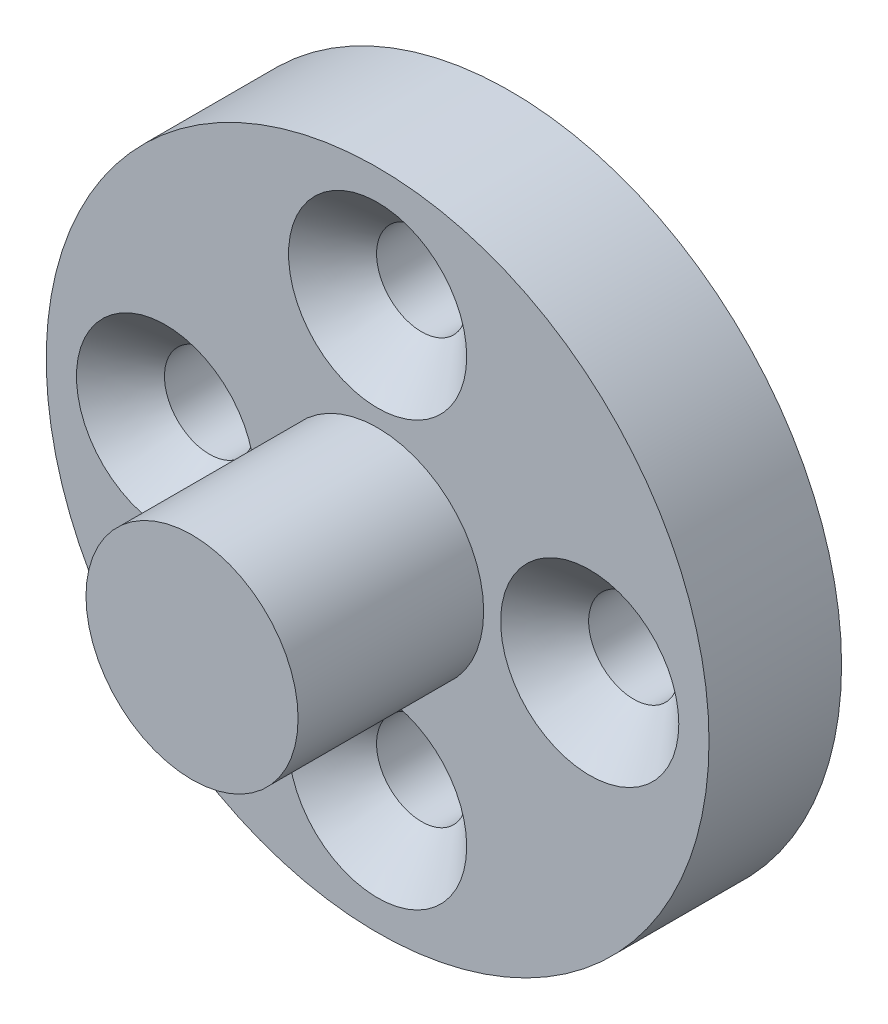
ISO-10303-21;
HEADER;
FILE_DESCRIPTION(('STEP AP214'),'2;1');
FILE_NAME('part.step','',(''),(''),'','','');
FILE_SCHEMA(('AUTOMOTIVE_DESIGN { 1 0 10303 214 1 1 1 1 }'));
ENDSEC;
DATA;
#1=APPLICATION_CONTEXT('core data for automotive mechanical design processes');
#2=APPLICATION_PROTOCOL_DEFINITION('international standard','automotive_design',2000,#1);
#3=PRODUCT_CONTEXT('',#1,'mechanical');
#4=PRODUCT('Part','Part','',(#3));
#5=PRODUCT_RELATED_PRODUCT_CATEGORY('part','',(#4));
#6=PRODUCT_DEFINITION_FORMATION('','',#4);
#7=PRODUCT_DEFINITION_CONTEXT('part definition',#1,'design');
#8=PRODUCT_DEFINITION('design','',#6,#7);
#9=PRODUCT_DEFINITION_SHAPE('','',#8);
#10=(LENGTH_UNIT() NAMED_UNIT(*) SI_UNIT(.MILLI.,.METRE.));
#11=(NAMED_UNIT(*) PLANE_ANGLE_UNIT() SI_UNIT($,.RADIAN.));
#12=(NAMED_UNIT(*) SI_UNIT($,.STERADIAN.) SOLID_ANGLE_UNIT());
#13=UNCERTAINTY_MEASURE_WITH_UNIT(LENGTH_MEASURE(1.E-05),#10,'distance_accuracy_value','');
#14=(GEOMETRIC_REPRESENTATION_CONTEXT(3) GLOBAL_UNCERTAINTY_ASSIGNED_CONTEXT((#13)) GLOBAL_UNIT_ASSIGNED_CONTEXT((#10,
#11,#12)) REPRESENTATION_CONTEXT('',''));
#15=CARTESIAN_POINT('',(0.,0.,0.));
#16=DIRECTION('',(0.,0.,1.));
#17=DIRECTION('',(1.,0.,0.));
#18=AXIS2_PLACEMENT_3D('',#15,#16,#17);
#19=CARTESIAN_POINT('',(0.,0.,5.));
#20=DIRECTION('',(0.,0.,-1.));
#21=DIRECTION('',(-1.,0.,0.));
#22=AXIS2_PLACEMENT_3D('',#19,#20,#21);
#23=CYLINDRICAL_SURFACE('',#22,12.5);
#24=CARTESIAN_POINT('',(0.,0.,5.));
#25=DIRECTION('',(0.,0.,1.));
#26=DIRECTION('',(1.,0.,0.));
#27=AXIS2_PLACEMENT_3D('',#24,#25,#26);
#28=CIRCLE('',#27,12.5);
#29=CARTESIAN_POINT('',(12.5,0.,5.));
#30=VERTEX_POINT('',#29);
#31=EDGE_CURVE('E39',#30,#30,#28,.T.);
#32=ORIENTED_EDGE('',*,*,#31,.F.);
#33=EDGE_LOOP('',(#32));
#34=FACE_BOUND('',#33,.T.);
#35=CARTESIAN_POINT('',(0.,0.,0.));
#36=DIRECTION('',(0.,0.,1.));
#37=DIRECTION('',(1.,0.,0.));
#38=AXIS2_PLACEMENT_3D('',#35,#36,#37);
#39=CIRCLE('',#38,12.5);
#40=CARTESIAN_POINT('',(12.5,0.,0.));
#41=VERTEX_POINT('',#40);
#42=EDGE_CURVE('E35',#41,#41,#39,.T.);
#43=ORIENTED_EDGE('',*,*,#42,.T.);
#44=EDGE_LOOP('',(#43));
#45=FACE_BOUND('',#44,.T.);
#46=ADVANCED_FACE('F32',(#34,#45),#23,.T.);
#47=CARTESIAN_POINT('',(0.,0.,5.));
#48=DIRECTION('',(0.,0.,1.));
#49=DIRECTION('',(1.,0.,0.));
#50=AXIS2_PLACEMENT_3D('',#47,#48,#49);
#51=PLANE('',#50);
#52=CARTESIAN_POINT('',(0.,8.,5.));
#53=DIRECTION('',(0.,0.,1.));
#54=DIRECTION('',(1.,0.,0.));
#55=AXIS2_PLACEMENT_3D('',#52,#53,#54);
#56=CIRCLE('',#55,3.36);
#57=CARTESIAN_POINT('',(3.36,8.,5.));
#58=VERTEX_POINT('',#57);
#59=EDGE_CURVE('E81',#58,#58,#56,.T.);
#60=ORIENTED_EDGE('',*,*,#59,.F.);
#61=EDGE_LOOP('',(#60));
#62=FACE_BOUND('',#61,.T.);
#63=CARTESIAN_POINT('',(8.00000000000023,2.25904099284255E-13,5.));
#64=DIRECTION('',(0.,0.,1.));
#65=DIRECTION('',(1.,0.,0.));
#66=AXIS2_PLACEMENT_3D('',#63,#64,#65);
#67=CIRCLE('',#66,3.36);
#68=CARTESIAN_POINT('',(11.3600000000002,2.25904099284255E-13,5.));
#69=VERTEX_POINT('',#68);
#70=EDGE_CURVE('E72',#69,#69,#67,.T.);
#71=ORIENTED_EDGE('',*,*,#70,.F.);
#72=EDGE_LOOP('',(#71));
#73=FACE_BOUND('',#72,.T.);
#74=CARTESIAN_POINT('',(4.51808198568511E-13,-8.,5.));
#75=DIRECTION('',(0.,0.,1.));
#76=DIRECTION('',(1.,0.,0.));
#77=AXIS2_PLACEMENT_3D('',#74,#75,#76);
#78=CIRCLE('',#77,3.36);
#79=CARTESIAN_POINT('',(3.36000000000045,-8.,5.));
#80=VERTEX_POINT('',#79);
#81=EDGE_CURVE('E63',#80,#80,#78,.T.);
#82=ORIENTED_EDGE('',*,*,#81,.F.);
#83=EDGE_LOOP('',(#82));
#84=FACE_BOUND('',#83,.T.);
#85=CARTESIAN_POINT('',(-7.99999999999977,-2.24924381844937E-13,5.));
#86=DIRECTION('',(0.,0.,1.));
#87=DIRECTION('',(1.,0.,0.));
#88=AXIS2_PLACEMENT_3D('',#85,#86,#87);
#89=CIRCLE('',#88,3.36);
#90=CARTESIAN_POINT('',(-4.63999999999977,-2.24924381844937E-13,5.));
#91=VERTEX_POINT('',#90);
#92=EDGE_CURVE('E54',#91,#91,#89,.T.);
#93=ORIENTED_EDGE('',*,*,#92,.F.);
#94=EDGE_LOOP('',(#93));
#95=FACE_BOUND('',#94,.T.);
#96=CARTESIAN_POINT('',(0.,0.,5.));
#97=DIRECTION('',(0.,0.,1.));
#98=DIRECTION('',(1.,0.,0.));
#99=AXIS2_PLACEMENT_3D('',#96,#97,#98);
#100=CIRCLE('',#99,4.);
#101=CARTESIAN_POINT('',(4.,0.,5.));
#102=VERTEX_POINT('',#101);
#103=EDGE_CURVE('E10',#102,#102,#100,.T.);
#104=ORIENTED_EDGE('',*,*,#103,.F.);
#105=EDGE_LOOP('',(#104));
#106=FACE_BOUND('',#105,.T.);
#107=ORIENTED_EDGE('',*,*,#31,.T.);
#108=EDGE_LOOP('',(#107));
#109=FACE_BOUND('',#108,.T.);
#110=ADVANCED_FACE('F87',(#62,#73,#84,#95,#106,#109),#51,.T.);
#111=CARTESIAN_POINT('',(0.,0.,0.));
#112=DIRECTION('',(0.,0.,1.));
#113=DIRECTION('',(1.,0.,0.));
#114=AXIS2_PLACEMENT_3D('',#111,#112,#113);
#115=PLANE('',#114);
#116=CARTESIAN_POINT('',(0.,8.,0.));
#117=DIRECTION('',(0.,0.,1.));
#118=DIRECTION('',(1.,0.,0.));
#119=AXIS2_PLACEMENT_3D('',#116,#117,#118);
#120=CIRCLE('',#119,1.7);
#121=CARTESIAN_POINT('',(1.7,8.,0.));
#122=VERTEX_POINT('',#121);
#123=EDGE_CURVE('E75',#122,#122,#120,.T.);
#124=ORIENTED_EDGE('',*,*,#123,.T.);
#125=EDGE_LOOP('',(#124));
#126=FACE_BOUND('',#125,.T.);
#127=CARTESIAN_POINT('',(8.00000000000023,2.25904099284255E-13,0.));
#128=DIRECTION('',(0.,0.,1.));
#129=DIRECTION('',(1.,0.,0.));
#130=AXIS2_PLACEMENT_3D('',#127,#128,#129);
#131=CIRCLE('',#130,1.7);
#132=CARTESIAN_POINT('',(9.70000000000022,2.25904099284255E-13,0.));
#133=VERTEX_POINT('',#132);
#134=EDGE_CURVE('E66',#133,#133,#131,.T.);
#135=ORIENTED_EDGE('',*,*,#134,.T.);
#136=EDGE_LOOP('',(#135));
#137=FACE_BOUND('',#136,.T.);
#138=CARTESIAN_POINT('',(4.51808198568511E-13,-8.,0.));
#139=DIRECTION('',(0.,0.,1.));
#140=DIRECTION('',(1.,0.,0.));
#141=AXIS2_PLACEMENT_3D('',#138,#139,#140);
#142=CIRCLE('',#141,1.7);
#143=CARTESIAN_POINT('',(1.70000000000045,-8.,0.));
#144=VERTEX_POINT('',#143);
#145=EDGE_CURVE('E57',#144,#144,#142,.T.);
#146=ORIENTED_EDGE('',*,*,#145,.T.);
#147=EDGE_LOOP('',(#146));
#148=FACE_BOUND('',#147,.T.);
#149=CARTESIAN_POINT('',(-7.99999999999977,-2.24924381844937E-13,0.));
#150=DIRECTION('',(0.,0.,1.));
#151=DIRECTION('',(1.,0.,0.));
#152=AXIS2_PLACEMENT_3D('',#149,#150,#151);
#153=CIRCLE('',#152,1.7);
#154=CARTESIAN_POINT('',(-6.29999999999978,-2.24924381844937E-13,0.));
#155=VERTEX_POINT('',#154);
#156=EDGE_CURVE('E48',#155,#155,#153,.T.);
#157=ORIENTED_EDGE('',*,*,#156,.T.);
#158=EDGE_LOOP('',(#157));
#159=FACE_BOUND('',#158,.T.);
#160=ORIENTED_EDGE('',*,*,#42,.F.);
#161=EDGE_LOOP('',(#160));
#162=FACE_BOUND('',#161,.T.);
#163=ADVANCED_FACE('F90',(#126,#137,#148,#159,#162),#115,.F.);
#164=CARTESIAN_POINT('',(0.,0.,12.));
#165=DIRECTION('',(0.,0.,-1.));
#166=DIRECTION('',(-1.,0.,0.));
#167=AXIS2_PLACEMENT_3D('',#164,#165,#166);
#168=CYLINDRICAL_SURFACE('',#167,4.);
#169=CARTESIAN_POINT('',(0.,0.,12.));
#170=DIRECTION('',(0.,0.,1.));
#171=DIRECTION('',(1.,0.,0.));
#172=AXIS2_PLACEMENT_3D('',#169,#170,#171);
#173=CIRCLE('',#172,4.);
#174=CARTESIAN_POINT('',(4.,0.,12.));
#175=VERTEX_POINT('',#174);
#176=EDGE_CURVE('E45',#175,#175,#173,.T.);
#177=ORIENTED_EDGE('',*,*,#176,.F.);
#178=EDGE_LOOP('',(#177));
#179=FACE_BOUND('',#178,.T.);
#180=ORIENTED_EDGE('',*,*,#103,.T.);
#181=EDGE_LOOP('',(#180));
#182=FACE_BOUND('',#181,.T.);
#183=ADVANCED_FACE('F107',(#179,#182),#168,.T.);
#184=CARTESIAN_POINT('',(0.,0.,12.));
#185=DIRECTION('',(0.,0.,1.));
#186=DIRECTION('',(1.,0.,0.));
#187=AXIS2_PLACEMENT_3D('',#184,#185,#186);
#188=PLANE('',#187);
#189=ORIENTED_EDGE('',*,*,#176,.T.);
#190=EDGE_LOOP('',(#189));
#191=FACE_BOUND('',#190,.T.);
#192=ADVANCED_FACE('F112',(#191),#188,.T.);
#193=CARTESIAN_POINT('',(-7.99999999999977,-2.24924381844937E-13,5.));
#194=DIRECTION('',(0.,0.,1.));
#195=DIRECTION('',(1.,0.,0.));
#196=AXIS2_PLACEMENT_3D('',#193,#194,#195);
#197=CYLINDRICAL_SURFACE('',#196,1.7);
#198=ORIENTED_EDGE('',*,*,#156,.F.);
#199=EDGE_LOOP('',(#198));
#200=FACE_BOUND('',#199,.T.);
#201=CARTESIAN_POINT('',(-7.99999999999977,-2.24924381844937E-13,3.34));
#202=DIRECTION('',(0.,0.,1.));
#203=DIRECTION('',(1.,0.,0.));
#204=AXIS2_PLACEMENT_3D('',#201,#202,#203);
#205=CIRCLE('',#204,1.7);
#206=CARTESIAN_POINT('',(-6.29999999999978,-2.24924381844937E-13,3.34));
#207=VERTEX_POINT('',#206);
#208=EDGE_CURVE('E51',#207,#207,#205,.T.);
#209=ORIENTED_EDGE('',*,*,#208,.T.);
#210=EDGE_LOOP('',(#209));
#211=FACE_BOUND('',#210,.T.);
#212=ADVANCED_FACE('F119',(#200,#211),#197,.F.);
#213=CARTESIAN_POINT('',(-7.99999999999977,-2.24924381844937E-13,5.));
#214=DIRECTION('',(0.,0.,1.));
#215=DIRECTION('',(1.,0.,0.));
#216=AXIS2_PLACEMENT_3D('',#213,#214,#215);
#217=CONICAL_SURFACE('',#216,3.36,0.785398163397448);
#218=ORIENTED_EDGE('',*,*,#208,.F.);
#219=EDGE_LOOP('',(#218));
#220=FACE_BOUND('',#219,.T.);
#221=ORIENTED_EDGE('',*,*,#92,.T.);
#222=EDGE_LOOP('',(#221));
#223=FACE_BOUND('',#222,.T.);
#224=ADVANCED_FACE('F123',(#220,#223),#217,.F.);
#225=CARTESIAN_POINT('',(4.51808198568511E-13,-8.,5.));
#226=DIRECTION('',(0.,0.,1.));
#227=DIRECTION('',(1.,0.,0.));
#228=AXIS2_PLACEMENT_3D('',#225,#226,#227);
#229=CYLINDRICAL_SURFACE('',#228,1.7);
#230=ORIENTED_EDGE('',*,*,#145,.F.);
#231=EDGE_LOOP('',(#230));
#232=FACE_BOUND('',#231,.T.);
#233=CARTESIAN_POINT('',(4.51808198568511E-13,-8.,3.34));
#234=DIRECTION('',(0.,0.,1.));
#235=DIRECTION('',(1.,0.,0.));
#236=AXIS2_PLACEMENT_3D('',#233,#234,#235);
#237=CIRCLE('',#236,1.7);
#238=CARTESIAN_POINT('',(1.70000000000045,-8.,3.34));
#239=VERTEX_POINT('',#238);
#240=EDGE_CURVE('E60',#239,#239,#237,.T.);
#241=ORIENTED_EDGE('',*,*,#240,.T.);
#242=EDGE_LOOP('',(#241));
#243=FACE_BOUND('',#242,.T.);
#244=ADVANCED_FACE('F127',(#232,#243),#229,.F.);
#245=CARTESIAN_POINT('',(4.51808198568511E-13,-8.,5.));
#246=DIRECTION('',(0.,0.,1.));
#247=DIRECTION('',(1.,0.,0.));
#248=AXIS2_PLACEMENT_3D('',#245,#246,#247);
#249=CONICAL_SURFACE('',#248,3.36,0.785398163397448);
#250=ORIENTED_EDGE('',*,*,#240,.F.);
#251=EDGE_LOOP('',(#250));
#252=FACE_BOUND('',#251,.T.);
#253=ORIENTED_EDGE('',*,*,#81,.T.);
#254=EDGE_LOOP('',(#253));
#255=FACE_BOUND('',#254,.T.);
#256=ADVANCED_FACE('F131',(#252,#255),#249,.F.);
#257=CARTESIAN_POINT('',(8.00000000000023,2.25904099284255E-13,5.));
#258=DIRECTION('',(0.,0.,1.));
#259=DIRECTION('',(1.,0.,0.));
#260=AXIS2_PLACEMENT_3D('',#257,#258,#259);
#261=CYLINDRICAL_SURFACE('',#260,1.7);
#262=ORIENTED_EDGE('',*,*,#134,.F.);
#263=EDGE_LOOP('',(#262));
#264=FACE_BOUND('',#263,.T.);
#265=CARTESIAN_POINT('',(8.00000000000023,2.25904099284255E-13,3.34));
#266=DIRECTION('',(0.,0.,1.));
#267=DIRECTION('',(1.,0.,0.));
#268=AXIS2_PLACEMENT_3D('',#265,#266,#267);
#269=CIRCLE('',#268,1.7);
#270=CARTESIAN_POINT('',(9.70000000000022,2.25904099284255E-13,3.34));
#271=VERTEX_POINT('',#270);
#272=EDGE_CURVE('E69',#271,#271,#269,.T.);
#273=ORIENTED_EDGE('',*,*,#272,.T.);
#274=EDGE_LOOP('',(#273));
#275=FACE_BOUND('',#274,.T.);
#276=ADVANCED_FACE('F135',(#264,#275),#261,.F.);
#277=CARTESIAN_POINT('',(8.00000000000023,2.25904099284255E-13,5.));
#278=DIRECTION('',(0.,0.,1.));
#279=DIRECTION('',(1.,0.,0.));
#280=AXIS2_PLACEMENT_3D('',#277,#278,#279);
#281=CONICAL_SURFACE('',#280,3.36,0.785398163397448);
#282=ORIENTED_EDGE('',*,*,#272,.F.);
#283=EDGE_LOOP('',(#282));
#284=FACE_BOUND('',#283,.T.);
#285=ORIENTED_EDGE('',*,*,#70,.T.);
#286=EDGE_LOOP('',(#285));
#287=FACE_BOUND('',#286,.T.);
#288=ADVANCED_FACE('F139',(#284,#287),#281,.F.);
#289=CARTESIAN_POINT('',(0.,8.,5.));
#290=DIRECTION('',(0.,0.,1.));
#291=DIRECTION('',(1.,0.,0.));
#292=AXIS2_PLACEMENT_3D('',#289,#290,#291);
#293=CYLINDRICAL_SURFACE('',#292,1.7);
#294=ORIENTED_EDGE('',*,*,#123,.F.);
#295=EDGE_LOOP('',(#294));
#296=FACE_BOUND('',#295,.T.);
#297=CARTESIAN_POINT('',(0.,8.,3.34));
#298=DIRECTION('',(0.,0.,1.));
#299=DIRECTION('',(1.,0.,0.));
#300=AXIS2_PLACEMENT_3D('',#297,#298,#299);
#301=CIRCLE('',#300,1.7);
#302=CARTESIAN_POINT('',(1.7,8.,3.34));
#303=VERTEX_POINT('',#302);
#304=EDGE_CURVE('E78',#303,#303,#301,.T.);
#305=ORIENTED_EDGE('',*,*,#304,.T.);
#306=EDGE_LOOP('',(#305));
#307=FACE_BOUND('',#306,.T.);
#308=ADVANCED_FACE('F143',(#296,#307),#293,.F.);
#309=CARTESIAN_POINT('',(0.,8.,5.));
#310=DIRECTION('',(0.,0.,1.));
#311=DIRECTION('',(1.,0.,0.));
#312=AXIS2_PLACEMENT_3D('',#309,#310,#311);
#313=CONICAL_SURFACE('',#312,3.36,0.785398163397448);
#314=ORIENTED_EDGE('',*,*,#304,.F.);
#315=EDGE_LOOP('',(#314));
#316=FACE_BOUND('',#315,.T.);
#317=ORIENTED_EDGE('',*,*,#59,.T.);
#318=EDGE_LOOP('',(#317));
#319=FACE_BOUND('',#318,.T.);
#320=ADVANCED_FACE('F85',(#316,#319),#313,.F.);
#321=CLOSED_SHELL('',(#46,#110,#163,#183,#192,#212,#224,#244,#256,#276,#288,#308,#320));
#322=MANIFOLD_SOLID_BREP('B2',#321);
#323=ADVANCED_BREP_SHAPE_REPRESENTATION('',(#18,#322),#14);
#324=SHAPE_DEFINITION_REPRESENTATION(#9,#323);
ENDSEC;
END-ISO-10303-21;
